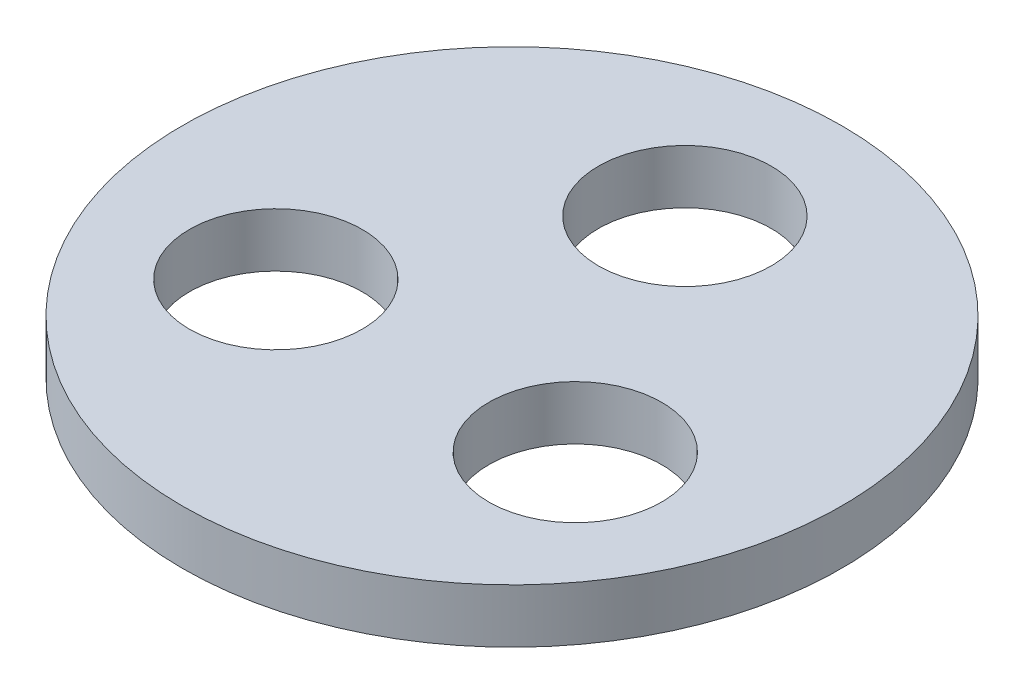
ISO-10303-21;
HEADER;
FILE_DESCRIPTION(('STEP AP214'),'2;1');
FILE_NAME('part.step','',(''),(''),'','','');
FILE_SCHEMA(('AUTOMOTIVE_DESIGN { 1 0 10303 214 1 1 1 1 }'));
ENDSEC;
DATA;
#1=APPLICATION_CONTEXT('core data for automotive mechanical design processes');
#2=APPLICATION_PROTOCOL_DEFINITION('international standard','automotive_design',2000,#1);
#3=PRODUCT_CONTEXT('',#1,'mechanical');
#4=PRODUCT('Part','Part','',(#3));
#5=PRODUCT_RELATED_PRODUCT_CATEGORY('part','',(#4));
#6=PRODUCT_DEFINITION_FORMATION('','',#4);
#7=PRODUCT_DEFINITION_CONTEXT('part definition',#1,'design');
#8=PRODUCT_DEFINITION('design','',#6,#7);
#9=PRODUCT_DEFINITION_SHAPE('','',#8);
#10=(LENGTH_UNIT() NAMED_UNIT(*) SI_UNIT(.MILLI.,.METRE.));
#11=(NAMED_UNIT(*) PLANE_ANGLE_UNIT() SI_UNIT($,.RADIAN.));
#12=(NAMED_UNIT(*) SI_UNIT($,.STERADIAN.) SOLID_ANGLE_UNIT());
#13=UNCERTAINTY_MEASURE_WITH_UNIT(LENGTH_MEASURE(1.E-05),#10,'distance_accuracy_value','');
#14=(GEOMETRIC_REPRESENTATION_CONTEXT(3) GLOBAL_UNCERTAINTY_ASSIGNED_CONTEXT((#13)) GLOBAL_UNIT_ASSIGNED_CONTEXT((#10,
#11,#12)) REPRESENTATION_CONTEXT('',''));
#15=CARTESIAN_POINT('',(0.,0.,0.));
#16=DIRECTION('',(0.,0.,1.));
#17=DIRECTION('',(1.,0.,0.));
#18=AXIS2_PLACEMENT_3D('',#15,#16,#17);
#19=CARTESIAN_POINT('',(27.7128129211033,10.,15.9999999999993));
#20=DIRECTION('',(0.,-1.,0.));
#21=DIRECTION('',(0.,0.,-1.));
#22=AXIS2_PLACEMENT_3D('',#19,#20,#21);
#23=CYLINDRICAL_SURFACE('',#22,16.);
#24=CARTESIAN_POINT('',(27.7128129211033,10.,15.9999999999993));
#25=DIRECTION('',(0.,1.,0.));
#26=DIRECTION('',(0.,0.,1.));
#27=AXIS2_PLACEMENT_3D('',#24,#25,#26);
#28=CIRCLE('',#27,16.);
#29=CARTESIAN_POINT('',(27.7128129211033,10.,31.9999999999993));
#30=VERTEX_POINT('',#29);
#31=EDGE_CURVE('E50',#30,#30,#28,.T.);
#32=ORIENTED_EDGE('',*,*,#31,.T.);
#33=EDGE_LOOP('',(#32));
#34=FACE_BOUND('',#33,.T.);
#35=CARTESIAN_POINT('',(27.7128129211033,0.,15.9999999999993));
#36=DIRECTION('',(0.,1.,0.));
#37=DIRECTION('',(0.,0.,1.));
#38=AXIS2_PLACEMENT_3D('',#35,#36,#37);
#39=CIRCLE('',#38,16.);
#40=CARTESIAN_POINT('',(27.7128129211033,0.,31.9999999999993));
#41=VERTEX_POINT('',#40);
#42=EDGE_CURVE('E67',#41,#41,#39,.T.);
#43=ORIENTED_EDGE('',*,*,#42,.F.);
#44=EDGE_LOOP('',(#43));
#45=FACE_BOUND('',#44,.T.);
#46=ADVANCED_FACE('F41',(#34,#45),#23,.F.);
#47=CARTESIAN_POINT('',(-27.7128129211008,10.,16.0000000000007));
#48=DIRECTION('',(0.,-1.,0.));
#49=DIRECTION('',(0.,0.,-1.));
#50=AXIS2_PLACEMENT_3D('',#47,#48,#49);
#51=CYLINDRICAL_SURFACE('',#50,16.);
#52=CARTESIAN_POINT('',(-27.7128129211008,10.,16.0000000000007));
#53=DIRECTION('',(0.,1.,0.));
#54=DIRECTION('',(0.,0.,1.));
#55=AXIS2_PLACEMENT_3D('',#52,#53,#54);
#56=CIRCLE('',#55,16.);
#57=CARTESIAN_POINT('',(-27.7128129211008,10.,32.0000000000007));
#58=VERTEX_POINT('',#57);
#59=EDGE_CURVE('E56',#58,#58,#56,.T.);
#60=ORIENTED_EDGE('',*,*,#59,.T.);
#61=EDGE_LOOP('',(#60));
#62=FACE_BOUND('',#61,.T.);
#63=CARTESIAN_POINT('',(-27.7128129211008,0.,16.0000000000007));
#64=DIRECTION('',(0.,1.,0.));
#65=DIRECTION('',(0.,0.,1.));
#66=AXIS2_PLACEMENT_3D('',#63,#64,#65);
#67=CIRCLE('',#66,16.);
#68=CARTESIAN_POINT('',(-27.7128129211008,0.,32.0000000000007));
#69=VERTEX_POINT('',#68);
#70=EDGE_CURVE('E64',#69,#69,#67,.T.);
#71=ORIENTED_EDGE('',*,*,#70,.F.);
#72=EDGE_LOOP('',(#71));
#73=FACE_BOUND('',#72,.T.);
#74=ADVANCED_FACE('F86',(#62,#73),#51,.F.);
#75=CARTESIAN_POINT('',(0.,10.,-32.));
#76=DIRECTION('',(0.,-1.,0.));
#77=DIRECTION('',(0.,0.,-1.));
#78=AXIS2_PLACEMENT_3D('',#75,#76,#77);
#79=CYLINDRICAL_SURFACE('',#78,16.);
#80=CARTESIAN_POINT('',(0.,10.,-32.));
#81=DIRECTION('',(0.,1.,0.));
#82=DIRECTION('',(0.,0.,1.));
#83=AXIS2_PLACEMENT_3D('',#80,#81,#82);
#84=CIRCLE('',#83,16.);
#85=CARTESIAN_POINT('',(0.,10.,-16.));
#86=VERTEX_POINT('',#85);
#87=EDGE_CURVE('E74',#86,#86,#84,.T.);
#88=ORIENTED_EDGE('',*,*,#87,.T.);
#89=EDGE_LOOP('',(#88));
#90=FACE_BOUND('',#89,.T.);
#91=CARTESIAN_POINT('',(0.,0.,-32.));
#92=DIRECTION('',(0.,1.,0.));
#93=DIRECTION('',(0.,0.,1.));
#94=AXIS2_PLACEMENT_3D('',#91,#92,#93);
#95=CIRCLE('',#94,16.);
#96=CARTESIAN_POINT('',(0.,0.,-16.));
#97=VERTEX_POINT('',#96);
#98=EDGE_CURVE('E60',#97,#97,#95,.T.);
#99=ORIENTED_EDGE('',*,*,#98,.F.);
#100=EDGE_LOOP('',(#99));
#101=FACE_BOUND('',#100,.T.);
#102=ADVANCED_FACE('F43',(#90,#101),#79,.F.);
#103=CARTESIAN_POINT('',(0.,10.,0.));
#104=DIRECTION('',(0.,-1.,0.));
#105=DIRECTION('',(0.,0.,-1.));
#106=AXIS2_PLACEMENT_3D('',#103,#104,#105);
#107=CYLINDRICAL_SURFACE('',#106,61.);
#108=CARTESIAN_POINT('',(0.,10.,0.));
#109=DIRECTION('',(0.,1.,0.));
#110=DIRECTION('',(0.,0.,1.));
#111=AXIS2_PLACEMENT_3D('',#108,#109,#110);
#112=CIRCLE('',#111,61.);
#113=CARTESIAN_POINT('',(0.,10.,61.));
#114=VERTEX_POINT('',#113);
#115=EDGE_CURVE('E10',#114,#114,#112,.T.);
#116=ORIENTED_EDGE('',*,*,#115,.F.);
#117=EDGE_LOOP('',(#116));
#118=FACE_BOUND('',#117,.T.);
#119=CARTESIAN_POINT('',(0.,0.,0.));
#120=DIRECTION('',(0.,1.,0.));
#121=DIRECTION('',(0.,0.,1.));
#122=AXIS2_PLACEMENT_3D('',#119,#120,#121);
#123=CIRCLE('',#122,61.);
#124=CARTESIAN_POINT('',(0.,0.,61.));
#125=VERTEX_POINT('',#124);
#126=EDGE_CURVE('E45',#125,#125,#123,.T.);
#127=ORIENTED_EDGE('',*,*,#126,.T.);
#128=EDGE_LOOP('',(#127));
#129=FACE_BOUND('',#128,.T.);
#130=ADVANCED_FACE('F93',(#118,#129),#107,.T.);
#131=CARTESIAN_POINT('',(0.,10.,0.));
#132=DIRECTION('',(0.,1.,0.));
#133=DIRECTION('',(0.,0.,1.));
#134=AXIS2_PLACEMENT_3D('',#131,#132,#133);
#135=PLANE('',#134);
#136=ORIENTED_EDGE('',*,*,#87,.F.);
#137=EDGE_LOOP('',(#136));
#138=FACE_BOUND('',#137,.T.);
#139=ORIENTED_EDGE('',*,*,#59,.F.);
#140=EDGE_LOOP('',(#139));
#141=FACE_BOUND('',#140,.T.);
#142=ORIENTED_EDGE('',*,*,#31,.F.);
#143=EDGE_LOOP('',(#142));
#144=FACE_BOUND('',#143,.T.);
#145=ORIENTED_EDGE('',*,*,#115,.T.);
#146=EDGE_LOOP('',(#145));
#147=FACE_BOUND('',#146,.T.);
#148=ADVANCED_FACE('F89',(#138,#141,#144,#147),#135,.T.);
#149=CARTESIAN_POINT('',(0.,0.,0.));
#150=DIRECTION('',(0.,1.,0.));
#151=DIRECTION('',(0.,0.,1.));
#152=AXIS2_PLACEMENT_3D('',#149,#150,#151);
#153=PLANE('',#152);
#154=ORIENTED_EDGE('',*,*,#98,.T.);
#155=EDGE_LOOP('',(#154));
#156=FACE_BOUND('',#155,.T.);
#157=ORIENTED_EDGE('',*,*,#70,.T.);
#158=EDGE_LOOP('',(#157));
#159=FACE_BOUND('',#158,.T.);
#160=ORIENTED_EDGE('',*,*,#42,.T.);
#161=EDGE_LOOP('',(#160));
#162=FACE_BOUND('',#161,.T.);
#163=ORIENTED_EDGE('',*,*,#126,.F.);
#164=EDGE_LOOP('',(#163));
#165=FACE_BOUND('',#164,.T.);
#166=ADVANCED_FACE('F92',(#156,#159,#162,#165),#153,.F.);
#167=CLOSED_SHELL('',(#46,#74,#102,#130,#148,#166));
#168=MANIFOLD_SOLID_BREP('B2',#167);
#169=ADVANCED_BREP_SHAPE_REPRESENTATION('',(#18,#168),#14);
#170=SHAPE_DEFINITION_REPRESENTATION(#9,#169);
ENDSEC;
END-ISO-10303-21;
